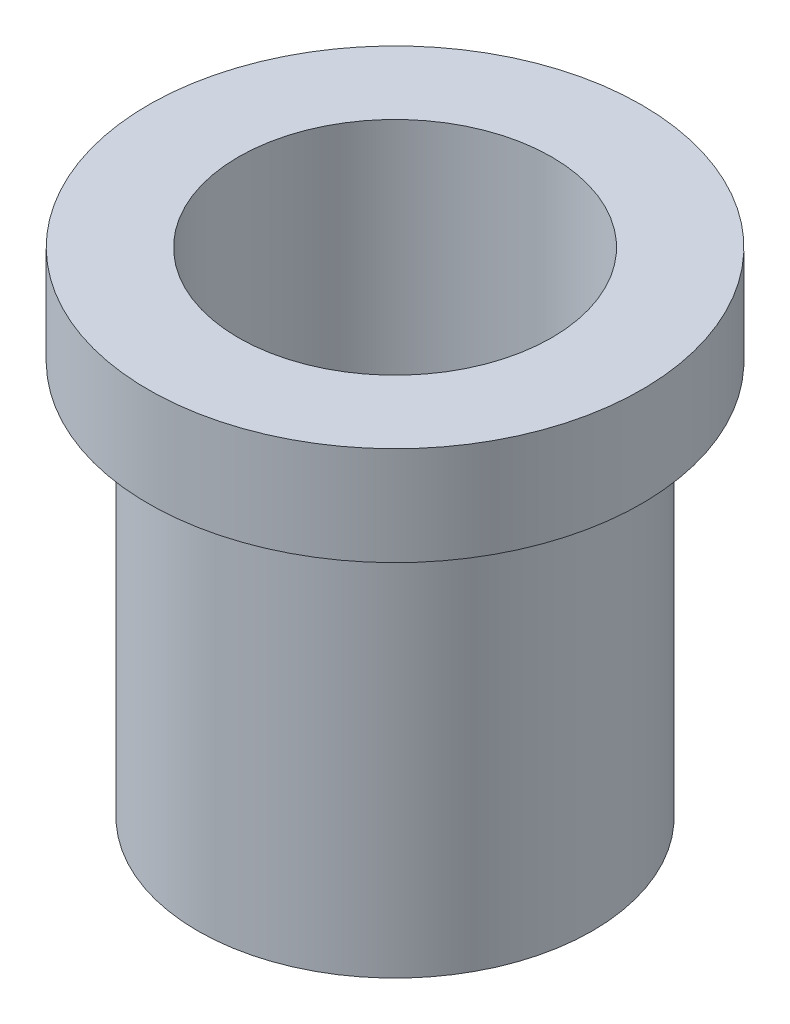
ISO-10303-21;
HEADER;
FILE_DESCRIPTION(('STEP AP214'),'2;1');
FILE_NAME('part.step','',(''),(''),'','','');
FILE_SCHEMA(('AUTOMOTIVE_DESIGN { 1 0 10303 214 1 1 1 1 }'));
ENDSEC;
DATA;
#1=APPLICATION_CONTEXT('core data for automotive mechanical design processes');
#2=APPLICATION_PROTOCOL_DEFINITION('international standard','automotive_design',2000,#1);
#3=PRODUCT_CONTEXT('',#1,'mechanical');
#4=PRODUCT('Part','Part','',(#3));
#5=PRODUCT_RELATED_PRODUCT_CATEGORY('part','',(#4));
#6=PRODUCT_DEFINITION_FORMATION('','',#4);
#7=PRODUCT_DEFINITION_CONTEXT('part definition',#1,'design');
#8=PRODUCT_DEFINITION('design','',#6,#7);
#9=PRODUCT_DEFINITION_SHAPE('','',#8);
#10=(LENGTH_UNIT() NAMED_UNIT(*) SI_UNIT(.MILLI.,.METRE.));
#11=(NAMED_UNIT(*) PLANE_ANGLE_UNIT() SI_UNIT($,.RADIAN.));
#12=(NAMED_UNIT(*) SI_UNIT($,.STERADIAN.) SOLID_ANGLE_UNIT());
#13=UNCERTAINTY_MEASURE_WITH_UNIT(LENGTH_MEASURE(1.E-05),#10,'distance_accuracy_value','');
#14=(GEOMETRIC_REPRESENTATION_CONTEXT(3) GLOBAL_UNCERTAINTY_ASSIGNED_CONTEXT((#13)) GLOBAL_UNIT_ASSIGNED_CONTEXT((#10,
#11,#12)) REPRESENTATION_CONTEXT('',''));
#15=CARTESIAN_POINT('',(0.,0.,0.));
#16=DIRECTION('',(0.,0.,1.));
#17=DIRECTION('',(1.,0.,0.));
#18=AXIS2_PLACEMENT_3D('',#15,#16,#17);
#19=CARTESIAN_POINT('',(0.,2.,0.));
#20=DIRECTION('',(0.,-1.,0.));
#21=DIRECTION('',(0.,0.,-1.));
#22=AXIS2_PLACEMENT_3D('',#19,#20,#21);
#23=PLANE('',#22);
#24=CARTESIAN_POINT('',(0.,2.,0.));
#25=DIRECTION('',(0.,-1.,0.));
#26=DIRECTION('',(0.,0.,-1.));
#27=AXIS2_PLACEMENT_3D('',#24,#25,#26);
#28=CIRCLE('',#27,3.175);
#29=CARTESIAN_POINT('',(0.,2.,-3.175));
#30=VERTEX_POINT('',#29);
#31=EDGE_CURVE('E34',#30,#30,#28,.T.);
#32=ORIENTED_EDGE('',*,*,#31,.T.);
#33=EDGE_LOOP('',(#32));
#34=FACE_BOUND('',#33,.T.);
#35=CARTESIAN_POINT('',(0.,2.,0.));
#36=DIRECTION('',(0.,-1.,0.));
#37=DIRECTION('',(0.,0.,-1.));
#38=AXIS2_PLACEMENT_3D('',#35,#36,#37);
#39=CIRCLE('',#38,5.);
#40=CARTESIAN_POINT('',(0.,2.,-5.));
#41=VERTEX_POINT('',#40);
#42=EDGE_CURVE('E18',#41,#41,#39,.T.);
#43=ORIENTED_EDGE('',*,*,#42,.F.);
#44=EDGE_LOOP('',(#43));
#45=FACE_BOUND('',#44,.T.);
#46=ADVANCED_FACE('F15',(#34,#45),#23,.F.);
#47=CARTESIAN_POINT('',(0.,2.5,0.));
#48=DIRECTION('',(0.,-1.,0.));
#49=DIRECTION('',(0.,0.,-1.));
#50=AXIS2_PLACEMENT_3D('',#47,#48,#49);
#51=CYLINDRICAL_SURFACE('',#50,5.);
#52=CARTESIAN_POINT('',(0.,0.,0.));
#53=DIRECTION('',(0.,-1.,0.));
#54=DIRECTION('',(0.,0.,-1.));
#55=AXIS2_PLACEMENT_3D('',#52,#53,#54);
#56=CIRCLE('',#55,5.);
#57=CARTESIAN_POINT('',(0.,0.,-5.));
#58=VERTEX_POINT('',#57);
#59=EDGE_CURVE('E32',#58,#58,#56,.T.);
#60=ORIENTED_EDGE('',*,*,#59,.F.);
#61=EDGE_LOOP('',(#60));
#62=FACE_BOUND('',#61,.T.);
#63=ORIENTED_EDGE('',*,*,#42,.T.);
#64=EDGE_LOOP('',(#63));
#65=FACE_BOUND('',#64,.T.);
#66=ADVANCED_FACE('F41',(#62,#65),#51,.T.);
#67=CARTESIAN_POINT('',(0.,2.5,0.));
#68=DIRECTION('',(0.,-1.,0.));
#69=DIRECTION('',(0.,0.,-1.));
#70=AXIS2_PLACEMENT_3D('',#67,#68,#69);
#71=CYLINDRICAL_SURFACE('',#70,3.175);
#72=CARTESIAN_POINT('',(0.,-8.,0.));
#73=DIRECTION('',(0.,-1.,0.));
#74=DIRECTION('',(0.,0.,-1.));
#75=AXIS2_PLACEMENT_3D('',#72,#73,#74);
#76=CIRCLE('',#75,3.175);
#77=CARTESIAN_POINT('',(0.,-8.,-3.175));
#78=VERTEX_POINT('',#77);
#79=EDGE_CURVE('E27',#78,#78,#76,.F.);
#80=ORIENTED_EDGE('',*,*,#79,.F.);
#81=EDGE_LOOP('',(#80));
#82=FACE_BOUND('',#81,.T.);
#83=ORIENTED_EDGE('',*,*,#31,.F.);
#84=EDGE_LOOP('',(#83));
#85=FACE_BOUND('',#84,.T.);
#86=ADVANCED_FACE('F48',(#82,#85),#71,.F.);
#87=CARTESIAN_POINT('',(0.,0.,0.));
#88=DIRECTION('',(0.,-1.,0.));
#89=DIRECTION('',(0.,0.,-1.));
#90=AXIS2_PLACEMENT_3D('',#87,#88,#89);
#91=PLANE('',#90);
#92=CARTESIAN_POINT('',(0.,0.,0.));
#93=DIRECTION('',(0.,-1.,0.));
#94=DIRECTION('',(0.,0.,-1.));
#95=AXIS2_PLACEMENT_3D('',#92,#93,#94);
#96=CIRCLE('',#95,4.);
#97=CARTESIAN_POINT('',(0.,0.,-4.));
#98=VERTEX_POINT('',#97);
#99=EDGE_CURVE('E22',#98,#98,#96,.T.);
#100=ORIENTED_EDGE('',*,*,#99,.F.);
#101=EDGE_LOOP('',(#100));
#102=FACE_BOUND('',#101,.T.);
#103=ORIENTED_EDGE('',*,*,#59,.T.);
#104=EDGE_LOOP('',(#103));
#105=FACE_BOUND('',#104,.T.);
#106=ADVANCED_FACE('F57',(#102,#105),#91,.T.);
#107=CARTESIAN_POINT('',(0.,-8.,0.));
#108=DIRECTION('',(0.,-1.,0.));
#109=DIRECTION('',(0.,0.,-1.));
#110=AXIS2_PLACEMENT_3D('',#107,#108,#109);
#111=PLANE('',#110);
#112=ORIENTED_EDGE('',*,*,#79,.T.);
#113=EDGE_LOOP('',(#112));
#114=FACE_BOUND('',#113,.T.);
#115=CARTESIAN_POINT('',(0.,-8.,0.));
#116=DIRECTION('',(0.,-1.,0.));
#117=DIRECTION('',(0.,0.,-1.));
#118=AXIS2_PLACEMENT_3D('',#115,#116,#117);
#119=CIRCLE('',#118,4.);
#120=CARTESIAN_POINT('',(0.,-8.,-4.));
#121=VERTEX_POINT('',#120);
#122=EDGE_CURVE('E10',#121,#121,#119,.F.);
#123=ORIENTED_EDGE('',*,*,#122,.F.);
#124=EDGE_LOOP('',(#123));
#125=FACE_BOUND('',#124,.T.);
#126=ADVANCED_FACE('F52',(#114,#125),#111,.T.);
#127=CARTESIAN_POINT('',(0.,2.5,0.));
#128=DIRECTION('',(0.,-1.,0.));
#129=DIRECTION('',(0.,0.,-1.));
#130=AXIS2_PLACEMENT_3D('',#127,#128,#129);
#131=CYLINDRICAL_SURFACE('',#130,4.);
#132=ORIENTED_EDGE('',*,*,#122,.T.);
#133=EDGE_LOOP('',(#132));
#134=FACE_BOUND('',#133,.T.);
#135=ORIENTED_EDGE('',*,*,#99,.T.);
#136=EDGE_LOOP('',(#135));
#137=FACE_BOUND('',#136,.T.);
#138=ADVANCED_FACE('F50',(#134,#137),#131,.T.);
#139=CLOSED_SHELL('',(#46,#66,#86,#106,#126,#138));
#140=MANIFOLD_SOLID_BREP('B1',#139);
#141=ADVANCED_BREP_SHAPE_REPRESENTATION('',(#18,#140),#14);
#142=SHAPE_DEFINITION_REPRESENTATION(#9,#141);
ENDSEC;
END-ISO-10303-21;
